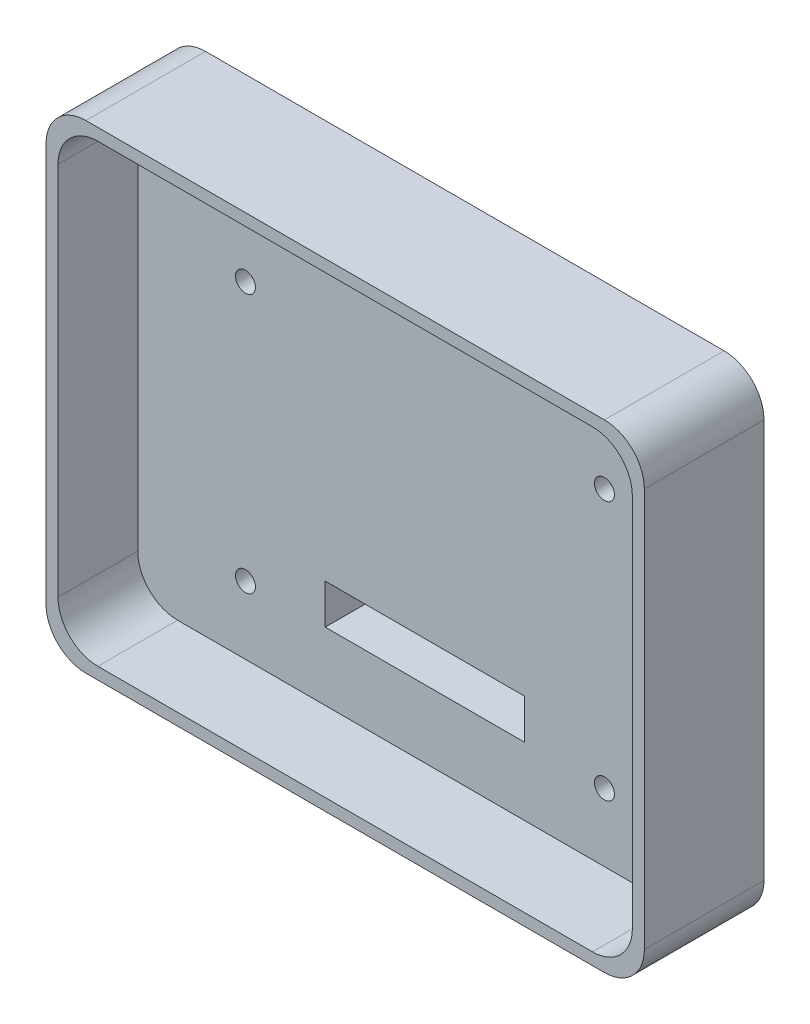
ISO-10303-21;
HEADER;
FILE_DESCRIPTION(('STEP AP214'),'2;1');
FILE_NAME('part.step','',(''),(''),'','','');
FILE_SCHEMA(('AUTOMOTIVE_DESIGN { 1 0 10303 214 1 1 1 1 }'));
ENDSEC;
DATA;
#1=APPLICATION_CONTEXT('core data for automotive mechanical design processes');
#2=APPLICATION_PROTOCOL_DEFINITION('international standard','automotive_design',2000,#1);
#3=PRODUCT_CONTEXT('',#1,'mechanical');
#4=PRODUCT('Part','Part','',(#3));
#5=PRODUCT_RELATED_PRODUCT_CATEGORY('part','',(#4));
#6=PRODUCT_DEFINITION_FORMATION('','',#4);
#7=PRODUCT_DEFINITION_CONTEXT('part definition',#1,'design');
#8=PRODUCT_DEFINITION('design','',#6,#7);
#9=PRODUCT_DEFINITION_SHAPE('','',#8);
#10=(LENGTH_UNIT() NAMED_UNIT(*) SI_UNIT(.MILLI.,.METRE.));
#11=(NAMED_UNIT(*) PLANE_ANGLE_UNIT() SI_UNIT($,.RADIAN.));
#12=(NAMED_UNIT(*) SI_UNIT($,.STERADIAN.) SOLID_ANGLE_UNIT());
#13=UNCERTAINTY_MEASURE_WITH_UNIT(LENGTH_MEASURE(1.E-05),#10,'distance_accuracy_value','');
#14=(GEOMETRIC_REPRESENTATION_CONTEXT(3) GLOBAL_UNCERTAINTY_ASSIGNED_CONTEXT((#13)) GLOBAL_UNIT_ASSIGNED_CONTEXT((#10,
#11,#12)) REPRESENTATION_CONTEXT('',''));
#15=CARTESIAN_POINT('',(0.,0.,0.));
#16=DIRECTION('',(0.,0.,1.));
#17=DIRECTION('',(1.,0.,0.));
#18=AXIS2_PLACEMENT_3D('',#15,#16,#17);
#19=CARTESIAN_POINT('',(-174.668715257413,84.7961921894447,30.));
#20=DIRECTION('',(-1.,0.,0.));
#21=DIRECTION('',(0.,-1.,0.));
#22=AXIS2_PLACEMENT_3D('',#19,#20,#21);
#23=PLANE('',#22);
#24=DIRECTION('',(0.,1.,0.));
#25=VECTOR('',#24,1.);
#26=CARTESIAN_POINT('',(-174.668715257413,84.7961921894447,30.));
#27=LINE('',#26,#25);
#28=CARTESIAN_POINT('',(-174.668715257413,-25.2038078105553,30.));
#29=VERTEX_POINT('',#28);
#30=CARTESIAN_POINT('',(-174.668715257413,74.7961921894447,30.));
#31=VERTEX_POINT('',#30);
#32=EDGE_CURVE('E344',#29,#31,#27,.T.);
#33=ORIENTED_EDGE('',*,*,#32,.F.);
#34=DIRECTION('',(0.,0.,-1.));
#35=VECTOR('',#34,1.);
#36=CARTESIAN_POINT('',(-174.668715257413,-25.2038078105553,30.));
#37=LINE('',#36,#35);
#38=CARTESIAN_POINT('',(-174.668715257413,-25.2038078105553,0.));
#39=VERTEX_POINT('',#38);
#40=EDGE_CURVE('E424',#29,#39,#37,.T.);
#41=ORIENTED_EDGE('',*,*,#40,.T.);
#42=DIRECTION('',(0.,1.,0.));
#43=VECTOR('',#42,1.);
#44=CARTESIAN_POINT('',(-174.668715257413,84.7961921894447,0.));
#45=LINE('',#44,#43);
#46=CARTESIAN_POINT('',(-174.668715257413,74.7961921894447,0.));
#47=VERTEX_POINT('',#46);
#48=EDGE_CURVE('E309',#39,#47,#45,.T.);
#49=ORIENTED_EDGE('',*,*,#48,.T.);
#50=DIRECTION('',(0.,0.,-1.));
#51=VECTOR('',#50,1.);
#52=CARTESIAN_POINT('',(-174.668715257413,74.7961921894447,30.));
#53=LINE('',#52,#51);
#54=EDGE_CURVE('E422',#47,#31,#53,.F.);
#55=ORIENTED_EDGE('',*,*,#54,.T.);
#56=EDGE_LOOP('',(#33,#41,#49,#55));
#57=FACE_BOUND('',#56,.T.);
#58=ADVANCED_FACE('F32',(#57),#23,.F.);
#59=CARTESIAN_POINT('',(-324.668715257413,84.7961921894447,30.));
#60=DIRECTION('',(0.,-1.,0.));
#61=DIRECTION('',(0.,0.,-1.));
#62=AXIS2_PLACEMENT_3D('',#59,#60,#61);
#63=PLANE('',#62);
#64=DIRECTION('',(-1.,0.,0.));
#65=VECTOR('',#64,1.);
#66=CARTESIAN_POINT('',(-324.668715257413,84.7961921894447,30.));
#67=LINE('',#66,#65);
#68=CARTESIAN_POINT('',(-184.668715257413,84.7961921894447,30.));
#69=VERTEX_POINT('',#68);
#70=CARTESIAN_POINT('',(-314.668715257413,84.7961921894447,30.));
#71=VERTEX_POINT('',#70);
#72=EDGE_CURVE('E347',#69,#71,#67,.T.);
#73=ORIENTED_EDGE('',*,*,#72,.F.);
#74=DIRECTION('',(0.,0.,-1.));
#75=VECTOR('',#74,1.);
#76=CARTESIAN_POINT('',(-184.668715257413,84.7961921894447,30.));
#77=LINE('',#76,#75);
#78=CARTESIAN_POINT('',(-184.668715257413,84.7961921894447,0.));
#79=VERTEX_POINT('',#78);
#80=EDGE_CURVE('E429',#69,#79,#77,.T.);
#81=ORIENTED_EDGE('',*,*,#80,.T.);
#82=DIRECTION('',(-1.,0.,0.));
#83=VECTOR('',#82,1.);
#84=CARTESIAN_POINT('',(-324.668715257413,84.7961921894447,0.));
#85=LINE('',#84,#83);
#86=CARTESIAN_POINT('',(-314.668715257413,84.7961921894447,0.));
#87=VERTEX_POINT('',#86);
#88=EDGE_CURVE('E360',#79,#87,#85,.T.);
#89=ORIENTED_EDGE('',*,*,#88,.T.);
#90=DIRECTION('',(0.,0.,-1.));
#91=VECTOR('',#90,1.);
#92=CARTESIAN_POINT('',(-314.668715257413,84.7961921894447,30.));
#93=LINE('',#92,#91);
#94=EDGE_CURVE('E427',#87,#71,#93,.F.);
#95=ORIENTED_EDGE('',*,*,#94,.T.);
#96=EDGE_LOOP('',(#73,#81,#89,#95));
#97=FACE_BOUND('',#96,.T.);
#98=ADVANCED_FACE('F472',(#97),#63,.F.);
#99=CARTESIAN_POINT('',(-324.668715257413,84.7961921894447,30.));
#100=DIRECTION('',(1.,0.,0.));
#101=DIRECTION('',(0.,0.,-1.));
#102=AXIS2_PLACEMENT_3D('',#99,#100,#101);
#103=PLANE('',#102);
#104=DIRECTION('',(0.,-1.,0.));
#105=VECTOR('',#104,1.);
#106=CARTESIAN_POINT('',(-324.668715257413,84.7961921894447,0.));
#107=LINE('',#106,#105);
#108=CARTESIAN_POINT('',(-324.668715257413,74.7961921894447,0.));
#109=VERTEX_POINT('',#108);
#110=CARTESIAN_POINT('',(-324.668715257413,-25.2038078105553,0.));
#111=VERTEX_POINT('',#110);
#112=EDGE_CURVE('E363',#109,#111,#107,.T.);
#113=ORIENTED_EDGE('',*,*,#112,.T.);
#114=DIRECTION('',(0.,0.,-1.));
#115=VECTOR('',#114,1.);
#116=CARTESIAN_POINT('',(-324.668715257413,-25.2038078105553,30.));
#117=LINE('',#116,#115);
#118=CARTESIAN_POINT('',(-324.668715257413,-25.2038078105553,30.));
#119=VERTEX_POINT('',#118);
#120=EDGE_CURVE('E412',#111,#119,#117,.F.);
#121=ORIENTED_EDGE('',*,*,#120,.T.);
#122=DIRECTION('',(0.,-1.,0.));
#123=VECTOR('',#122,1.);
#124=CARTESIAN_POINT('',(-324.668715257413,84.7961921894447,30.));
#125=LINE('',#124,#123);
#126=CARTESIAN_POINT('',(-324.668715257413,74.7961921894447,30.));
#127=VERTEX_POINT('',#126);
#128=EDGE_CURVE('E351',#127,#119,#125,.T.);
#129=ORIENTED_EDGE('',*,*,#128,.F.);
#130=DIRECTION('',(0.,0.,-1.));
#131=VECTOR('',#130,1.);
#132=CARTESIAN_POINT('',(-324.668715257413,74.7961921894447,30.));
#133=LINE('',#132,#131);
#134=EDGE_CURVE('E409',#127,#109,#133,.T.);
#135=ORIENTED_EDGE('',*,*,#134,.T.);
#136=EDGE_LOOP('',(#113,#121,#129,#135));
#137=FACE_BOUND('',#136,.T.);
#138=ADVANCED_FACE('F478',(#137),#103,.F.);
#139=CARTESIAN_POINT('',(-324.668715257413,-35.2038078105553,30.));
#140=DIRECTION('',(0.,1.,0.));
#141=DIRECTION('',(0.,0.,1.));
#142=AXIS2_PLACEMENT_3D('',#139,#140,#141);
#143=PLANE('',#142);
#144=DIRECTION('',(1.,0.,0.));
#145=VECTOR('',#144,1.);
#146=CARTESIAN_POINT('',(-324.668715257413,-35.2038078105553,30.));
#147=LINE('',#146,#145);
#148=CARTESIAN_POINT('',(-314.668715257413,-35.2038078105553,30.));
#149=VERTEX_POINT('',#148);
#150=CARTESIAN_POINT('',(-184.668715257413,-35.2038078105553,30.));
#151=VERTEX_POINT('',#150);
#152=EDGE_CURVE('E354',#149,#151,#147,.T.);
#153=ORIENTED_EDGE('',*,*,#152,.F.);
#154=DIRECTION('',(0.,0.,-1.));
#155=VECTOR('',#154,1.);
#156=CARTESIAN_POINT('',(-314.668715257413,-35.2038078105553,30.));
#157=LINE('',#156,#155);
#158=CARTESIAN_POINT('',(-314.668715257413,-35.2038078105553,0.));
#159=VERTEX_POINT('',#158);
#160=EDGE_CURVE('E398',#149,#159,#157,.T.);
#161=ORIENTED_EDGE('',*,*,#160,.T.);
#162=DIRECTION('',(1.,0.,0.));
#163=VECTOR('',#162,1.);
#164=CARTESIAN_POINT('',(-324.668715257413,-35.2038078105553,0.));
#165=LINE('',#164,#163);
#166=CARTESIAN_POINT('',(-307.168715257413,-35.2038078105553,0.));
#167=VERTEX_POINT('',#166);
#168=EDGE_CURVE('E348',#159,#167,#165,.T.);
#169=ORIENTED_EDGE('',*,*,#168,.T.);
#170=DIRECTION('',(0.,0.,-1.));
#171=VECTOR('',#170,1.);
#172=CARTESIAN_POINT('',(-307.168715257413,-35.2038078105553,6.5));
#173=LINE('',#172,#171);
#174=CARTESIAN_POINT('',(-307.168715257413,-35.2038078105553,6.5));
#175=VERTEX_POINT('',#174);
#176=EDGE_CURVE('E339',#175,#167,#173,.T.);
#177=ORIENTED_EDGE('',*,*,#176,.F.);
#178=DIRECTION('',(-1.,0.,0.));
#179=VECTOR('',#178,1.);
#180=CARTESIAN_POINT('',(-282.168715257413,-35.2038078105553,6.5));
#181=LINE('',#180,#179);
#182=CARTESIAN_POINT('',(-282.168715257413,-35.2038078105553,6.5));
#183=VERTEX_POINT('',#182);
#184=EDGE_CURVE('E319',#183,#175,#181,.T.);
#185=ORIENTED_EDGE('',*,*,#184,.F.);
#186=DIRECTION('',(0.,0.,-1.));
#187=VECTOR('',#186,1.);
#188=CARTESIAN_POINT('',(-282.168715257413,-35.2038078105553,6.5));
#189=LINE('',#188,#187);
#190=CARTESIAN_POINT('',(-282.168715257413,-35.2038078105553,0.));
#191=VERTEX_POINT('',#190);
#192=EDGE_CURVE('E329',#183,#191,#189,.T.);
#193=ORIENTED_EDGE('',*,*,#192,.T.);
#194=CARTESIAN_POINT('',(-217.168715257413,-35.2038078105553,0.));
#195=VERTEX_POINT('',#194);
#196=EDGE_CURVE('E368',#191,#195,#165,.T.);
#197=ORIENTED_EDGE('',*,*,#196,.T.);
#198=DIRECTION('',(0.,0.,-1.));
#199=VECTOR('',#198,1.);
#200=CARTESIAN_POINT('',(-217.168715257413,-35.2038078105553,6.5));
#201=LINE('',#200,#199);
#202=CARTESIAN_POINT('',(-217.168715257413,-35.2038078105553,6.5));
#203=VERTEX_POINT('',#202);
#204=EDGE_CURVE('E312',#203,#195,#201,.T.);
#205=ORIENTED_EDGE('',*,*,#204,.F.);
#206=DIRECTION('',(-1.,0.,0.));
#207=VECTOR('',#206,1.);
#208=CARTESIAN_POINT('',(-192.168715257413,-35.2038078105553,6.5));
#209=LINE('',#208,#207);
#210=CARTESIAN_POINT('',(-192.168715257413,-35.2038078105553,6.5));
#211=VERTEX_POINT('',#210);
#212=EDGE_CURVE('E288',#211,#203,#209,.T.);
#213=ORIENTED_EDGE('',*,*,#212,.F.);
#214=DIRECTION('',(0.,0.,-1.));
#215=VECTOR('',#214,1.);
#216=CARTESIAN_POINT('',(-192.168715257413,-35.2038078105553,6.5));
#217=LINE('',#216,#215);
#218=CARTESIAN_POINT('',(-192.168715257413,-35.2038078105553,0.));
#219=VERTEX_POINT('',#218);
#220=EDGE_CURVE('E298',#211,#219,#217,.T.);
#221=ORIENTED_EDGE('',*,*,#220,.T.);
#222=CARTESIAN_POINT('',(-184.668715257413,-35.2038078105553,0.));
#223=VERTEX_POINT('',#222);
#224=EDGE_CURVE('E366',#219,#223,#165,.T.);
#225=ORIENTED_EDGE('',*,*,#224,.T.);
#226=DIRECTION('',(0.,0.,-1.));
#227=VECTOR('',#226,1.);
#228=CARTESIAN_POINT('',(-184.668715257413,-35.2038078105553,30.));
#229=LINE('',#228,#227);
#230=EDGE_CURVE('E396',#223,#151,#229,.F.);
#231=ORIENTED_EDGE('',*,*,#230,.T.);
#232=EDGE_LOOP('',(#153,#161,#169,#177,#185,#193,#197,#205,#213,#221,#225,#231));
#233=FACE_BOUND('',#232,.T.);
#234=ADVANCED_FACE('F534',(#233),#143,.F.);
#235=CARTESIAN_POINT('',(0.,0.,30.));
#236=DIRECTION('',(0.,0.,1.));
#237=DIRECTION('',(1.,0.,0.));
#238=AXIS2_PLACEMENT_3D('',#235,#236,#237);
#239=PLANE('',#238);
#240=DIRECTION('',(0.,1.,0.));
#241=VECTOR('',#240,1.);
#242=CARTESIAN_POINT('',(-177.668715257413,81.7961921894447,30.));
#243=LINE('',#242,#241);
#244=CARTESIAN_POINT('',(-177.668715257413,-22.2038078105553,30.));
#245=VERTEX_POINT('',#244);
#246=CARTESIAN_POINT('',(-177.668715257413,71.7961921894447,30.));
#247=VERTEX_POINT('',#246);
#248=EDGE_CURVE('E274',#245,#247,#243,.T.);
#249=ORIENTED_EDGE('',*,*,#248,.F.);
#250=CARTESIAN_POINT('',(-187.668715257413,-22.2038078105553,30.));
#251=DIRECTION('',(0.,0.,1.));
#252=DIRECTION('',(1.,0.,0.));
#253=AXIS2_PLACEMENT_3D('',#250,#251,#252);
#254=CIRCLE('',#253,10.);
#255=CARTESIAN_POINT('',(-187.668715257413,-32.2038078105553,30.));
#256=VERTEX_POINT('',#255);
#257=EDGE_CURVE('E432',#245,#256,#254,.F.);
#258=ORIENTED_EDGE('',*,*,#257,.T.);
#259=DIRECTION('',(1.,0.,0.));
#260=VECTOR('',#259,1.);
#261=CARTESIAN_POINT('',(-321.668715257413,-32.2038078105553,30.));
#262=LINE('',#261,#260);
#263=CARTESIAN_POINT('',(-311.668715257413,-32.2038078105553,30.));
#264=VERTEX_POINT('',#263);
#265=EDGE_CURVE('E264',#264,#256,#262,.T.);
#266=ORIENTED_EDGE('',*,*,#265,.F.);
#267=CARTESIAN_POINT('',(-311.668715257413,-22.2038078105553,30.));
#268=DIRECTION('',(0.,0.,1.));
#269=DIRECTION('',(1.,0.,0.));
#270=AXIS2_PLACEMENT_3D('',#267,#268,#269);
#271=CIRCLE('',#270,10.);
#272=CARTESIAN_POINT('',(-321.668715257413,-22.2038078105553,30.));
#273=VERTEX_POINT('',#272);
#274=EDGE_CURVE('E434',#264,#273,#271,.F.);
#275=ORIENTED_EDGE('',*,*,#274,.T.);
#276=DIRECTION('',(0.,-1.,0.));
#277=VECTOR('',#276,1.);
#278=CARTESIAN_POINT('',(-321.668715257413,81.7961921894447,30.));
#279=LINE('',#278,#277);
#280=CARTESIAN_POINT('',(-321.668715257413,71.7961921894447,30.));
#281=VERTEX_POINT('',#280);
#282=EDGE_CURVE('E280',#281,#273,#279,.T.);
#283=ORIENTED_EDGE('',*,*,#282,.F.);
#284=CARTESIAN_POINT('',(-311.668715257413,71.7961921894447,30.));
#285=DIRECTION('',(0.,0.,1.));
#286=DIRECTION('',(1.,0.,0.));
#287=AXIS2_PLACEMENT_3D('',#284,#285,#286);
#288=CIRCLE('',#287,10.);
#289=CARTESIAN_POINT('',(-311.668715257413,81.7961921894447,30.));
#290=VERTEX_POINT('',#289);
#291=EDGE_CURVE('E436',#281,#290,#288,.F.);
#292=ORIENTED_EDGE('',*,*,#291,.T.);
#293=DIRECTION('',(-1.,0.,0.));
#294=VECTOR('',#293,1.);
#295=CARTESIAN_POINT('',(-321.668715257413,81.7961921894447,30.));
#296=LINE('',#295,#294);
#297=CARTESIAN_POINT('',(-187.668715257413,81.7961921894447,30.));
#298=VERTEX_POINT('',#297);
#299=EDGE_CURVE('E277',#298,#290,#296,.T.);
#300=ORIENTED_EDGE('',*,*,#299,.F.);
#301=CARTESIAN_POINT('',(-187.668715257413,71.7961921894447,30.));
#302=DIRECTION('',(0.,0.,1.));
#303=DIRECTION('',(1.,0.,0.));
#304=AXIS2_PLACEMENT_3D('',#301,#302,#303);
#305=CIRCLE('',#304,10.);
#306=EDGE_CURVE('E438',#298,#247,#305,.F.);
#307=ORIENTED_EDGE('',*,*,#306,.T.);
#308=EDGE_LOOP('',(#249,#258,#266,#275,#283,#292,#300,#307));
#309=FACE_BOUND('',#308,.T.);
#310=ORIENTED_EDGE('',*,*,#128,.T.);
#311=CARTESIAN_POINT('',(-314.668715257413,-25.2038078105553,30.));
#312=DIRECTION('',(0.,0.,1.));
#313=DIRECTION('',(1.,0.,0.));
#314=AXIS2_PLACEMENT_3D('',#311,#312,#313);
#315=CIRCLE('',#314,10.);
#316=EDGE_CURVE('E420',#119,#149,#315,.T.);
#317=ORIENTED_EDGE('',*,*,#316,.T.);
#318=ORIENTED_EDGE('',*,*,#152,.T.);
#319=CARTESIAN_POINT('',(-184.668715257413,-25.2038078105553,30.));
#320=DIRECTION('',(0.,0.,1.));
#321=DIRECTION('',(1.,0.,0.));
#322=AXIS2_PLACEMENT_3D('',#319,#320,#321);
#323=CIRCLE('',#322,10.);
#324=EDGE_CURVE('E418',#151,#29,#323,.T.);
#325=ORIENTED_EDGE('',*,*,#324,.T.);
#326=ORIENTED_EDGE('',*,*,#32,.T.);
#327=CARTESIAN_POINT('',(-184.668715257413,74.7961921894447,30.));
#328=DIRECTION('',(0.,0.,1.));
#329=DIRECTION('',(1.,0.,0.));
#330=AXIS2_PLACEMENT_3D('',#327,#328,#329);
#331=CIRCLE('',#330,10.);
#332=EDGE_CURVE('E416',#31,#69,#331,.T.);
#333=ORIENTED_EDGE('',*,*,#332,.T.);
#334=ORIENTED_EDGE('',*,*,#72,.T.);
#335=CARTESIAN_POINT('',(-314.668715257413,74.7961921894447,30.));
#336=DIRECTION('',(0.,0.,1.));
#337=DIRECTION('',(1.,0.,0.));
#338=AXIS2_PLACEMENT_3D('',#335,#336,#337);
#339=CIRCLE('',#338,10.);
#340=EDGE_CURVE('E414',#71,#127,#339,.T.);
#341=ORIENTED_EDGE('',*,*,#340,.T.);
#342=EDGE_LOOP('',(#310,#317,#318,#325,#326,#333,#334,#341));
#343=FACE_BOUND('',#342,.T.);
#344=ADVANCED_FACE('F520',(#309,#343),#239,.T.);
#345=CARTESIAN_POINT('',(0.,0.,0.));
#346=DIRECTION('',(0.,0.,1.));
#347=DIRECTION('',(1.,0.,0.));
#348=AXIS2_PLACEMENT_3D('',#345,#346,#347);
#349=PLANE('',#348);
#350=DIRECTION('',(1.,0.,0.));
#351=VECTOR('',#350,1.);
#352=CARTESIAN_POINT('',(-224.668715257413,-5.20380781055533,0.));
#353=LINE('',#352,#351);
#354=CARTESIAN_POINT('',(-274.668715257413,-5.20380781055533,0.));
#355=VERTEX_POINT('',#354);
#356=CARTESIAN_POINT('',(-224.668715257413,-5.20380781055533,0.));
#357=VERTEX_POINT('',#356);
#358=EDGE_CURVE('E228',#355,#357,#353,.T.);
#359=ORIENTED_EDGE('',*,*,#358,.F.);
#360=DIRECTION('',(0.,1.,0.));
#361=VECTOR('',#360,1.);
#362=CARTESIAN_POINT('',(-274.668715257413,-5.20380781055533,0.));
#363=LINE('',#362,#361);
#364=CARTESIAN_POINT('',(-274.668715257413,-15.2038078105553,0.));
#365=VERTEX_POINT('',#364);
#366=EDGE_CURVE('E47',#365,#355,#363,.T.);
#367=ORIENTED_EDGE('',*,*,#366,.F.);
#368=DIRECTION('',(-1.,0.,0.));
#369=VECTOR('',#368,1.);
#370=CARTESIAN_POINT('',(-224.668715257413,-15.2038078105553,0.));
#371=LINE('',#370,#369);
#372=CARTESIAN_POINT('',(-224.668715257413,-15.2038078105553,0.));
#373=VERTEX_POINT('',#372);
#374=EDGE_CURVE('E235',#373,#365,#371,.T.);
#375=ORIENTED_EDGE('',*,*,#374,.F.);
#376=DIRECTION('',(0.,-1.,0.));
#377=VECTOR('',#376,1.);
#378=CARTESIAN_POINT('',(-224.668715257413,-5.20380781055533,0.));
#379=LINE('',#378,#377);
#380=EDGE_CURVE('E219',#357,#373,#379,.T.);
#381=ORIENTED_EDGE('',*,*,#380,.F.);
#382=EDGE_LOOP('',(#359,#367,#375,#381));
#383=FACE_BOUND('',#382,.T.);
#384=ORIENTED_EDGE('',*,*,#168,.F.);
#385=CARTESIAN_POINT('',(-314.668715257413,-25.2038078105553,0.));
#386=DIRECTION('',(0.,0.,1.));
#387=DIRECTION('',(1.,0.,0.));
#388=AXIS2_PLACEMENT_3D('',#385,#386,#387);
#389=CIRCLE('',#388,10.);
#390=EDGE_CURVE('E407',#159,#111,#389,.F.);
#391=ORIENTED_EDGE('',*,*,#390,.T.);
#392=ORIENTED_EDGE('',*,*,#112,.F.);
#393=CARTESIAN_POINT('',(-314.668715257413,74.7961921894447,0.));
#394=DIRECTION('',(0.,0.,1.));
#395=DIRECTION('',(1.,0.,0.));
#396=AXIS2_PLACEMENT_3D('',#393,#394,#395);
#397=CIRCLE('',#396,10.);
#398=EDGE_CURVE('E401',#109,#87,#397,.F.);
#399=ORIENTED_EDGE('',*,*,#398,.T.);
#400=ORIENTED_EDGE('',*,*,#88,.F.);
#401=CARTESIAN_POINT('',(-184.668715257413,74.7961921894447,0.));
#402=DIRECTION('',(0.,0.,1.));
#403=DIRECTION('',(1.,0.,0.));
#404=AXIS2_PLACEMENT_3D('',#401,#402,#403);
#405=CIRCLE('',#404,10.);
#406=EDGE_CURVE('E403',#79,#47,#405,.F.);
#407=ORIENTED_EDGE('',*,*,#406,.T.);
#408=ORIENTED_EDGE('',*,*,#48,.F.);
#409=CARTESIAN_POINT('',(-184.668715257413,-25.2038078105553,0.));
#410=DIRECTION('',(0.,0.,1.));
#411=DIRECTION('',(1.,0.,0.));
#412=AXIS2_PLACEMENT_3D('',#409,#410,#411);
#413=CIRCLE('',#412,10.);
#414=EDGE_CURVE('E405',#39,#223,#413,.F.);
#415=ORIENTED_EDGE('',*,*,#414,.T.);
#416=ORIENTED_EDGE('',*,*,#224,.F.);
#417=DIRECTION('',(0.,-1.,0.));
#418=VECTOR('',#417,1.);
#419=CARTESIAN_POINT('',(-192.168715257413,-35.2038078105553,0.));
#420=LINE('',#419,#418);
#421=CARTESIAN_POINT('',(-192.168715257413,69.7961921894447,0.));
#422=VERTEX_POINT('',#421);
#423=EDGE_CURVE('E299',#422,#219,#420,.T.);
#424=ORIENTED_EDGE('',*,*,#423,.F.);
#425=DIRECTION('',(1.,0.,0.));
#426=VECTOR('',#425,1.);
#427=CARTESIAN_POINT('',(-192.168715257413,69.7961921894447,0.));
#428=LINE('',#427,#426);
#429=CARTESIAN_POINT('',(-217.168715257413,69.7961921894447,0.));
#430=VERTEX_POINT('',#429);
#431=EDGE_CURVE('E289',#430,#422,#428,.T.);
#432=ORIENTED_EDGE('',*,*,#431,.F.);
#433=DIRECTION('',(0.,1.,0.));
#434=VECTOR('',#433,1.);
#435=CARTESIAN_POINT('',(-217.168715257413,-35.2038078105553,0.));
#436=LINE('',#435,#434);
#437=EDGE_CURVE('E301',#195,#430,#436,.T.);
#438=ORIENTED_EDGE('',*,*,#437,.F.);
#439=ORIENTED_EDGE('',*,*,#196,.F.);
#440=DIRECTION('',(0.,-1.,0.));
#441=VECTOR('',#440,1.);
#442=CARTESIAN_POINT('',(-282.168715257413,-35.2038078105553,0.));
#443=LINE('',#442,#441);
#444=CARTESIAN_POINT('',(-282.168715257413,69.7961921894447,0.));
#445=VERTEX_POINT('',#444);
#446=EDGE_CURVE('E273',#445,#191,#443,.T.);
#447=ORIENTED_EDGE('',*,*,#446,.F.);
#448=DIRECTION('',(1.,0.,0.));
#449=VECTOR('',#448,1.);
#450=CARTESIAN_POINT('',(-282.168715257413,69.7961921894447,0.));
#451=LINE('',#450,#449);
#452=CARTESIAN_POINT('',(-307.168715257413,69.7961921894447,0.));
#453=VERTEX_POINT('',#452);
#454=EDGE_CURVE('E320',#453,#445,#451,.T.);
#455=ORIENTED_EDGE('',*,*,#454,.F.);
#456=DIRECTION('',(0.,1.,0.));
#457=VECTOR('',#456,1.);
#458=CARTESIAN_POINT('',(-307.168715257413,-35.2038078105553,0.));
#459=LINE('',#458,#457);
#460=EDGE_CURVE('E331',#167,#453,#459,.T.);
#461=ORIENTED_EDGE('',*,*,#460,.F.);
#462=EDGE_LOOP('',(#384,#391,#392,#399,#400,#407,#408,#415,#416,#424,#432,#438,#439,#447,#455,#461));
#463=FACE_BOUND('',#462,.T.);
#464=ADVANCED_FACE('F232',(#383,#463),#349,.F.);
#465=CARTESIAN_POINT('',(-282.168715257413,-35.2038078105553,6.5));
#466=DIRECTION('',(1.,0.,0.));
#467=DIRECTION('',(0.,0.,-1.));
#468=AXIS2_PLACEMENT_3D('',#465,#466,#467);
#469=PLANE('',#468);
#470=ORIENTED_EDGE('',*,*,#446,.T.);
#471=ORIENTED_EDGE('',*,*,#192,.F.);
#472=DIRECTION('',(0.,-1.,0.));
#473=VECTOR('',#472,1.);
#474=CARTESIAN_POINT('',(-282.168715257413,-35.2038078105553,6.5));
#475=LINE('',#474,#473);
#476=CARTESIAN_POINT('',(-282.168715257413,69.7961921894447,6.5));
#477=VERTEX_POINT('',#476);
#478=EDGE_CURVE('E316',#477,#183,#475,.T.);
#479=ORIENTED_EDGE('',*,*,#478,.F.);
#480=DIRECTION('',(0.,0.,-1.));
#481=VECTOR('',#480,1.);
#482=CARTESIAN_POINT('',(-282.168715257413,69.7961921894447,6.5));
#483=LINE('',#482,#481);
#484=EDGE_CURVE('E302',#477,#445,#483,.T.);
#485=ORIENTED_EDGE('',*,*,#484,.T.);
#486=EDGE_LOOP('',(#470,#471,#479,#485));
#487=FACE_BOUND('',#486,.T.);
#488=ADVANCED_FACE('F587',(#487),#469,.F.);
#489=CARTESIAN_POINT('',(-282.168715257413,69.7961921894447,6.5));
#490=DIRECTION('',(0.,1.,0.));
#491=DIRECTION('',(0.,0.,1.));
#492=AXIS2_PLACEMENT_3D('',#489,#490,#491);
#493=PLANE('',#492);
#494=ORIENTED_EDGE('',*,*,#454,.T.);
#495=ORIENTED_EDGE('',*,*,#484,.F.);
#496=DIRECTION('',(1.,0.,0.));
#497=VECTOR('',#496,1.);
#498=CARTESIAN_POINT('',(-282.168715257413,69.7961921894447,6.5));
#499=LINE('',#498,#497);
#500=CARTESIAN_POINT('',(-307.168715257413,69.7961921894447,6.5));
#501=VERTEX_POINT('',#500);
#502=EDGE_CURVE('E326',#501,#477,#499,.T.);
#503=ORIENTED_EDGE('',*,*,#502,.F.);
#504=DIRECTION('',(0.,0.,-1.));
#505=VECTOR('',#504,1.);
#506=CARTESIAN_POINT('',(-307.168715257413,69.7961921894447,6.5));
#507=LINE('',#506,#505);
#508=EDGE_CURVE('E337',#501,#453,#507,.T.);
#509=ORIENTED_EDGE('',*,*,#508,.T.);
#510=EDGE_LOOP('',(#494,#495,#503,#509));
#511=FACE_BOUND('',#510,.T.);
#512=ADVANCED_FACE('F584',(#511),#493,.F.);
#513=CARTESIAN_POINT('',(-307.168715257413,-35.2038078105553,6.5));
#514=DIRECTION('',(-1.,0.,0.));
#515=DIRECTION('',(0.,-1.,0.));
#516=AXIS2_PLACEMENT_3D('',#513,#514,#515);
#517=PLANE('',#516);
#518=ORIENTED_EDGE('',*,*,#460,.T.);
#519=ORIENTED_EDGE('',*,*,#508,.F.);
#520=DIRECTION('',(0.,1.,0.));
#521=VECTOR('',#520,1.);
#522=CARTESIAN_POINT('',(-307.168715257413,-35.2038078105553,6.5));
#523=LINE('',#522,#521);
#524=EDGE_CURVE('E323',#175,#501,#523,.T.);
#525=ORIENTED_EDGE('',*,*,#524,.F.);
#526=ORIENTED_EDGE('',*,*,#176,.T.);
#527=EDGE_LOOP('',(#518,#519,#525,#526));
#528=FACE_BOUND('',#527,.T.);
#529=ADVANCED_FACE('F546',(#528),#517,.F.);
#530=CARTESIAN_POINT('',(0.,0.,6.5));
#531=DIRECTION('',(0.,0.,1.));
#532=DIRECTION('',(1.,0.,0.));
#533=AXIS2_PLACEMENT_3D('',#530,#531,#532);
#534=PLANE('',#533);
#535=CARTESIAN_POINT('',(-294.668715257413,49.7961921894447,6.5));
#536=DIRECTION('',(0.,0.,-1.));
#537=DIRECTION('',(-1.,0.,0.));
#538=AXIS2_PLACEMENT_3D('',#535,#536,#537);
#539=CIRCLE('',#538,2.5);
#540=CARTESIAN_POINT('',(-297.168715257413,49.7961921894447,6.5));
#541=VERTEX_POINT('',#540);
#542=EDGE_CURVE('E252',#541,#541,#539,.T.);
#543=ORIENTED_EDGE('',*,*,#542,.F.);
#544=EDGE_LOOP('',(#543));
#545=FACE_BOUND('',#544,.T.);
#546=CARTESIAN_POINT('',(-294.668715257413,-15.2038078105553,6.5));
#547=DIRECTION('',(0.,0.,-1.));
#548=DIRECTION('',(-1.,0.,0.));
#549=AXIS2_PLACEMENT_3D('',#546,#547,#548);
#550=CIRCLE('',#549,2.5);
#551=CARTESIAN_POINT('',(-297.168715257413,-15.2038078105553,6.5));
#552=VERTEX_POINT('',#551);
#553=EDGE_CURVE('E256',#552,#552,#550,.T.);
#554=ORIENTED_EDGE('',*,*,#553,.F.);
#555=EDGE_LOOP('',(#554));
#556=FACE_BOUND('',#555,.T.);
#557=ORIENTED_EDGE('',*,*,#478,.T.);
#558=ORIENTED_EDGE('',*,*,#184,.T.);
#559=ORIENTED_EDGE('',*,*,#524,.T.);
#560=ORIENTED_EDGE('',*,*,#502,.T.);
#561=EDGE_LOOP('',(#557,#558,#559,#560));
#562=FACE_BOUND('',#561,.T.);
#563=ADVANCED_FACE('F549',(#545,#556,#562),#534,.F.);
#564=CARTESIAN_POINT('',(-192.168715257413,-35.2038078105553,6.5));
#565=DIRECTION('',(1.,0.,0.));
#566=DIRECTION('',(0.,1.,0.));
#567=AXIS2_PLACEMENT_3D('',#564,#565,#566);
#568=PLANE('',#567);
#569=ORIENTED_EDGE('',*,*,#423,.T.);
#570=ORIENTED_EDGE('',*,*,#220,.F.);
#571=DIRECTION('',(0.,-1.,0.));
#572=VECTOR('',#571,1.);
#573=CARTESIAN_POINT('',(-192.168715257413,-35.2038078105553,6.5));
#574=LINE('',#573,#572);
#575=CARTESIAN_POINT('',(-192.168715257413,69.7961921894447,6.5));
#576=VERTEX_POINT('',#575);
#577=EDGE_CURVE('E285',#576,#211,#574,.T.);
#578=ORIENTED_EDGE('',*,*,#577,.F.);
#579=DIRECTION('',(0.,0.,-1.));
#580=VECTOR('',#579,1.);
#581=CARTESIAN_POINT('',(-192.168715257413,69.7961921894447,6.5));
#582=LINE('',#581,#580);
#583=EDGE_CURVE('E307',#576,#422,#582,.T.);
#584=ORIENTED_EDGE('',*,*,#583,.T.);
#585=EDGE_LOOP('',(#569,#570,#578,#584));
#586=FACE_BOUND('',#585,.T.);
#587=ADVANCED_FACE('F567',(#586),#568,.F.);
#588=CARTESIAN_POINT('',(-192.168715257413,69.7961921894447,6.5));
#589=DIRECTION('',(0.,1.,0.));
#590=DIRECTION('',(0.,0.,1.));
#591=AXIS2_PLACEMENT_3D('',#588,#589,#590);
#592=PLANE('',#591);
#593=ORIENTED_EDGE('',*,*,#431,.T.);
#594=ORIENTED_EDGE('',*,*,#583,.F.);
#595=DIRECTION('',(1.,0.,0.));
#596=VECTOR('',#595,1.);
#597=CARTESIAN_POINT('',(-192.168715257413,69.7961921894447,6.5));
#598=LINE('',#597,#596);
#599=CARTESIAN_POINT('',(-217.168715257413,69.7961921894447,6.5));
#600=VERTEX_POINT('',#599);
#601=EDGE_CURVE('E295',#600,#576,#598,.T.);
#602=ORIENTED_EDGE('',*,*,#601,.F.);
#603=DIRECTION('',(0.,0.,-1.));
#604=VECTOR('',#603,1.);
#605=CARTESIAN_POINT('',(-217.168715257413,69.7961921894447,6.5));
#606=LINE('',#605,#604);
#607=EDGE_CURVE('E310',#600,#430,#606,.T.);
#608=ORIENTED_EDGE('',*,*,#607,.T.);
#609=EDGE_LOOP('',(#593,#594,#602,#608));
#610=FACE_BOUND('',#609,.T.);
#611=ADVANCED_FACE('F569',(#610),#592,.F.);
#612=CARTESIAN_POINT('',(-217.168715257413,-35.2038078105553,6.5));
#613=DIRECTION('',(-1.,0.,0.));
#614=DIRECTION('',(0.,0.,1.));
#615=AXIS2_PLACEMENT_3D('',#612,#613,#614);
#616=PLANE('',#615);
#617=ORIENTED_EDGE('',*,*,#437,.T.);
#618=ORIENTED_EDGE('',*,*,#607,.F.);
#619=DIRECTION('',(0.,1.,0.));
#620=VECTOR('',#619,1.);
#621=CARTESIAN_POINT('',(-217.168715257413,-35.2038078105553,6.5));
#622=LINE('',#621,#620);
#623=EDGE_CURVE('E292',#203,#600,#622,.T.);
#624=ORIENTED_EDGE('',*,*,#623,.F.);
#625=ORIENTED_EDGE('',*,*,#204,.T.);
#626=EDGE_LOOP('',(#617,#618,#624,#625));
#627=FACE_BOUND('',#626,.T.);
#628=ADVANCED_FACE('F560',(#627),#616,.F.);
#629=CARTESIAN_POINT('',(0.,0.,6.5));
#630=DIRECTION('',(0.,0.,1.));
#631=DIRECTION('',(1.,0.,0.));
#632=AXIS2_PLACEMENT_3D('',#629,#630,#631);
#633=PLANE('',#632);
#634=CARTESIAN_POINT('',(-204.668715257413,49.7961921894447,6.5));
#635=DIRECTION('',(0.,0.,-1.));
#636=DIRECTION('',(-1.,0.,0.));
#637=AXIS2_PLACEMENT_3D('',#634,#635,#636);
#638=CIRCLE('',#637,2.5);
#639=CARTESIAN_POINT('',(-207.168715257413,49.7961921894447,6.5));
#640=VERTEX_POINT('',#639);
#641=EDGE_CURVE('E242',#640,#640,#638,.T.);
#642=ORIENTED_EDGE('',*,*,#641,.F.);
#643=EDGE_LOOP('',(#642));
#644=FACE_BOUND('',#643,.T.);
#645=CARTESIAN_POINT('',(-204.668715257413,-15.2038078105553,6.5));
#646=DIRECTION('',(0.,0.,-1.));
#647=DIRECTION('',(-1.,0.,0.));
#648=AXIS2_PLACEMENT_3D('',#645,#646,#647);
#649=CIRCLE('',#648,2.5);
#650=CARTESIAN_POINT('',(-207.168715257413,-15.2038078105553,6.5));
#651=VERTEX_POINT('',#650);
#652=EDGE_CURVE('E248',#651,#651,#649,.T.);
#653=ORIENTED_EDGE('',*,*,#652,.F.);
#654=EDGE_LOOP('',(#653));
#655=FACE_BOUND('',#654,.T.);
#656=ORIENTED_EDGE('',*,*,#577,.T.);
#657=ORIENTED_EDGE('',*,*,#212,.T.);
#658=ORIENTED_EDGE('',*,*,#623,.T.);
#659=ORIENTED_EDGE('',*,*,#601,.T.);
#660=EDGE_LOOP('',(#656,#657,#658,#659));
#661=FACE_BOUND('',#660,.T.);
#662=ADVANCED_FACE('F563',(#644,#655,#661),#633,.F.);
#663=CARTESIAN_POINT('',(-177.668715257413,81.7961921894447,10.));
#664=DIRECTION('',(1.,0.,0.));
#665=DIRECTION('',(0.,1.,0.));
#666=AXIS2_PLACEMENT_3D('',#663,#664,#665);
#667=PLANE('',#666);
#668=DIRECTION('',(0.,1.,0.));
#669=VECTOR('',#668,1.);
#670=CARTESIAN_POINT('',(-177.668715257413,81.7961921894447,10.));
#671=LINE('',#670,#669);
#672=CARTESIAN_POINT('',(-177.668715257413,-22.2038078105553,10.));
#673=VERTEX_POINT('',#672);
#674=CARTESIAN_POINT('',(-177.668715257413,71.7961921894447,10.));
#675=VERTEX_POINT('',#674);
#676=EDGE_CURVE('E260',#673,#675,#671,.T.);
#677=ORIENTED_EDGE('',*,*,#676,.F.);
#678=DIRECTION('',(0.,0.,1.));
#679=VECTOR('',#678,1.);
#680=CARTESIAN_POINT('',(-177.668715257413,-22.2038078105553,30.));
#681=LINE('',#680,#679);
#682=EDGE_CURVE('E370',#673,#245,#681,.T.);
#683=ORIENTED_EDGE('',*,*,#682,.T.);
#684=ORIENTED_EDGE('',*,*,#248,.T.);
#685=DIRECTION('',(0.,0.,1.));
#686=VECTOR('',#685,1.);
#687=CARTESIAN_POINT('',(-177.668715257413,71.7961921894447,10.));
#688=LINE('',#687,#686);
#689=EDGE_CURVE('E357',#247,#675,#688,.F.);
#690=ORIENTED_EDGE('',*,*,#689,.T.);
#691=EDGE_LOOP('',(#677,#683,#684,#690));
#692=FACE_BOUND('',#691,.T.);
#693=ADVANCED_FACE('F683',(#692),#667,.F.);
#694=CARTESIAN_POINT('',(-321.668715257413,-32.2038078105553,10.));
#695=DIRECTION('',(0.,-1.,0.));
#696=DIRECTION('',(0.,0.,-1.));
#697=AXIS2_PLACEMENT_3D('',#694,#695,#696);
#698=PLANE('',#697);
#699=ORIENTED_EDGE('',*,*,#265,.T.);
#700=DIRECTION('',(0.,0.,1.));
#701=VECTOR('',#700,1.);
#702=CARTESIAN_POINT('',(-187.668715257413,-32.2038078105553,10.));
#703=LINE('',#702,#701);
#704=CARTESIAN_POINT('',(-187.668715257413,-32.2038078105553,10.));
#705=VERTEX_POINT('',#704);
#706=EDGE_CURVE('E376',#256,#705,#703,.F.);
#707=ORIENTED_EDGE('',*,*,#706,.T.);
#708=DIRECTION('',(1.,0.,0.));
#709=VECTOR('',#708,1.);
#710=CARTESIAN_POINT('',(-321.668715257413,-32.2038078105553,10.));
#711=LINE('',#710,#709);
#712=CARTESIAN_POINT('',(-311.668715257413,-32.2038078105553,10.));
#713=VERTEX_POINT('',#712);
#714=EDGE_CURVE('E270',#713,#705,#711,.T.);
#715=ORIENTED_EDGE('',*,*,#714,.F.);
#716=DIRECTION('',(0.,0.,1.));
#717=VECTOR('',#716,1.);
#718=CARTESIAN_POINT('',(-311.668715257413,-32.2038078105553,30.));
#719=LINE('',#718,#717);
#720=EDGE_CURVE('E373',#713,#264,#719,.T.);
#721=ORIENTED_EDGE('',*,*,#720,.T.);
#722=EDGE_LOOP('',(#699,#707,#715,#721));
#723=FACE_BOUND('',#722,.T.);
#724=ADVANCED_FACE('F689',(#723),#698,.F.);
#725=CARTESIAN_POINT('',(-321.668715257413,81.7961921894447,10.));
#726=DIRECTION('',(-1.,0.,0.));
#727=DIRECTION('',(0.,0.,1.));
#728=AXIS2_PLACEMENT_3D('',#725,#726,#727);
#729=PLANE('',#728);
#730=ORIENTED_EDGE('',*,*,#282,.T.);
#731=DIRECTION('',(0.,0.,1.));
#732=VECTOR('',#731,1.);
#733=CARTESIAN_POINT('',(-321.668715257413,-22.2038078105553,10.));
#734=LINE('',#733,#732);
#735=CARTESIAN_POINT('',(-321.668715257413,-22.2038078105553,10.));
#736=VERTEX_POINT('',#735);
#737=EDGE_CURVE('E389',#273,#736,#734,.F.);
#738=ORIENTED_EDGE('',*,*,#737,.T.);
#739=DIRECTION('',(0.,-1.,0.));
#740=VECTOR('',#739,1.);
#741=CARTESIAN_POINT('',(-321.668715257413,81.7961921894447,10.));
#742=LINE('',#741,#740);
#743=CARTESIAN_POINT('',(-321.668715257413,71.7961921894447,10.));
#744=VERTEX_POINT('',#743);
#745=EDGE_CURVE('E267',#744,#736,#742,.T.);
#746=ORIENTED_EDGE('',*,*,#745,.F.);
#747=DIRECTION('',(0.,0.,1.));
#748=VECTOR('',#747,1.);
#749=CARTESIAN_POINT('',(-321.668715257413,71.7961921894447,30.));
#750=LINE('',#749,#748);
#751=EDGE_CURVE('E386',#744,#281,#750,.T.);
#752=ORIENTED_EDGE('',*,*,#751,.T.);
#753=EDGE_LOOP('',(#730,#738,#746,#752));
#754=FACE_BOUND('',#753,.T.);
#755=ADVANCED_FACE('F696',(#754),#729,.F.);
#756=CARTESIAN_POINT('',(-321.668715257413,81.7961921894447,10.));
#757=DIRECTION('',(0.,1.,0.));
#758=DIRECTION('',(0.,0.,1.));
#759=AXIS2_PLACEMENT_3D('',#756,#757,#758);
#760=PLANE('',#759);
#761=ORIENTED_EDGE('',*,*,#299,.T.);
#762=DIRECTION('',(0.,0.,1.));
#763=VECTOR('',#762,1.);
#764=CARTESIAN_POINT('',(-311.668715257413,81.7961921894447,10.));
#765=LINE('',#764,#763);
#766=CARTESIAN_POINT('',(-311.668715257413,81.7961921894447,10.));
#767=VERTEX_POINT('',#766);
#768=EDGE_CURVE('E394',#290,#767,#765,.F.);
#769=ORIENTED_EDGE('',*,*,#768,.T.);
#770=DIRECTION('',(-1.,0.,0.));
#771=VECTOR('',#770,1.);
#772=CARTESIAN_POINT('',(-321.668715257413,81.7961921894447,10.));
#773=LINE('',#772,#771);
#774=CARTESIAN_POINT('',(-187.668715257413,81.7961921894447,10.));
#775=VERTEX_POINT('',#774);
#776=EDGE_CURVE('E263',#775,#767,#773,.T.);
#777=ORIENTED_EDGE('',*,*,#776,.F.);
#778=DIRECTION('',(0.,0.,1.));
#779=VECTOR('',#778,1.);
#780=CARTESIAN_POINT('',(-187.668715257413,81.7961921894447,30.));
#781=LINE('',#780,#779);
#782=EDGE_CURVE('E391',#775,#298,#781,.T.);
#783=ORIENTED_EDGE('',*,*,#782,.T.);
#784=EDGE_LOOP('',(#761,#769,#777,#783));
#785=FACE_BOUND('',#784,.T.);
#786=ADVANCED_FACE('F704',(#785),#760,.F.);
#787=CARTESIAN_POINT('',(0.,0.,10.));
#788=DIRECTION('',(0.,0.,1.));
#789=DIRECTION('',(1.,0.,0.));
#790=AXIS2_PLACEMENT_3D('',#787,#788,#789);
#791=PLANE('',#790);
#792=DIRECTION('',(0.,-1.,0.));
#793=VECTOR('',#792,1.);
#794=CARTESIAN_POINT('',(-274.668715257413,0.,10.));
#795=LINE('',#794,#793);
#796=CARTESIAN_POINT('',(-274.668715257413,-5.20380781055533,10.));
#797=VERTEX_POINT('',#796);
#798=CARTESIAN_POINT('',(-274.668715257413,-15.2038078105553,10.));
#799=VERTEX_POINT('',#798);
#800=EDGE_CURVE('E11',#797,#799,#795,.T.);
#801=ORIENTED_EDGE('',*,*,#800,.F.);
#802=DIRECTION('',(-1.,0.,0.));
#803=VECTOR('',#802,1.);
#804=CARTESIAN_POINT('',(0.,-5.20380781055533,10.));
#805=LINE('',#804,#803);
#806=CARTESIAN_POINT('',(-224.668715257413,-5.20380781055533,10.));
#807=VERTEX_POINT('',#806);
#808=EDGE_CURVE('E440',#807,#797,#805,.T.);
#809=ORIENTED_EDGE('',*,*,#808,.F.);
#810=DIRECTION('',(0.,1.,0.));
#811=VECTOR('',#810,1.);
#812=CARTESIAN_POINT('',(-224.668715257413,0.,10.));
#813=LINE('',#812,#811);
#814=CARTESIAN_POINT('',(-224.668715257413,-15.2038078105553,10.));
#815=VERTEX_POINT('',#814);
#816=EDGE_CURVE('E222',#815,#807,#813,.T.);
#817=ORIENTED_EDGE('',*,*,#816,.F.);
#818=DIRECTION('',(1.,0.,0.));
#819=VECTOR('',#818,1.);
#820=CARTESIAN_POINT('',(0.,-15.2038078105553,10.));
#821=LINE('',#820,#819);
#822=EDGE_CURVE('E40',#799,#815,#821,.T.);
#823=ORIENTED_EDGE('',*,*,#822,.F.);
#824=EDGE_LOOP('',(#801,#809,#817,#823));
#825=FACE_BOUND('',#824,.T.);
#826=CARTESIAN_POINT('',(-204.668715257413,49.7961921894447,10.));
#827=DIRECTION('',(0.,0.,1.));
#828=DIRECTION('',(1.,0.,0.));
#829=AXIS2_PLACEMENT_3D('',#826,#827,#828);
#830=CIRCLE('',#829,2.49999999999999);
#831=CARTESIAN_POINT('',(-202.168715257413,49.7961921894447,10.));
#832=VERTEX_POINT('',#831);
#833=EDGE_CURVE('E247',#832,#832,#830,.T.);
#834=ORIENTED_EDGE('',*,*,#833,.F.);
#835=EDGE_LOOP('',(#834));
#836=FACE_BOUND('',#835,.T.);
#837=CARTESIAN_POINT('',(-204.668715257413,-15.2038078105553,10.));
#838=DIRECTION('',(0.,0.,1.));
#839=DIRECTION('',(1.,0.,0.));
#840=AXIS2_PLACEMENT_3D('',#837,#838,#839);
#841=CIRCLE('',#840,2.49999999999999);
#842=CARTESIAN_POINT('',(-202.168715257413,-15.2038078105553,10.));
#843=VERTEX_POINT('',#842);
#844=EDGE_CURVE('E251',#843,#843,#841,.T.);
#845=ORIENTED_EDGE('',*,*,#844,.F.);
#846=EDGE_LOOP('',(#845));
#847=FACE_BOUND('',#846,.T.);
#848=CARTESIAN_POINT('',(-294.668715257413,49.7961921894447,10.));
#849=DIRECTION('',(0.,0.,1.));
#850=DIRECTION('',(1.,0.,0.));
#851=AXIS2_PLACEMENT_3D('',#848,#849,#850);
#852=CIRCLE('',#851,2.5);
#853=CARTESIAN_POINT('',(-292.168715257413,49.7961921894447,10.));
#854=VERTEX_POINT('',#853);
#855=EDGE_CURVE('E255',#854,#854,#852,.T.);
#856=ORIENTED_EDGE('',*,*,#855,.F.);
#857=EDGE_LOOP('',(#856));
#858=FACE_BOUND('',#857,.T.);
#859=CARTESIAN_POINT('',(-294.668715257413,-15.2038078105553,10.));
#860=DIRECTION('',(0.,0.,1.));
#861=DIRECTION('',(1.,0.,0.));
#862=AXIS2_PLACEMENT_3D('',#859,#860,#861);
#863=CIRCLE('',#862,2.5);
#864=CARTESIAN_POINT('',(-292.168715257413,-15.2038078105553,10.));
#865=VERTEX_POINT('',#864);
#866=EDGE_CURVE('E259',#865,#865,#863,.T.);
#867=ORIENTED_EDGE('',*,*,#866,.F.);
#868=EDGE_LOOP('',(#867));
#869=FACE_BOUND('',#868,.T.);
#870=ORIENTED_EDGE('',*,*,#714,.T.);
#871=CARTESIAN_POINT('',(-187.668715257413,-22.2038078105553,10.));
#872=DIRECTION('',(0.,0.,1.));
#873=DIRECTION('',(1.,0.,0.));
#874=AXIS2_PLACEMENT_3D('',#871,#872,#873);
#875=CIRCLE('',#874,10.);
#876=EDGE_CURVE('E384',#705,#673,#875,.T.);
#877=ORIENTED_EDGE('',*,*,#876,.T.);
#878=ORIENTED_EDGE('',*,*,#676,.T.);
#879=CARTESIAN_POINT('',(-187.668715257413,71.7961921894447,10.));
#880=DIRECTION('',(0.,0.,1.));
#881=DIRECTION('',(1.,0.,0.));
#882=AXIS2_PLACEMENT_3D('',#879,#880,#881);
#883=CIRCLE('',#882,10.);
#884=EDGE_CURVE('E378',#675,#775,#883,.T.);
#885=ORIENTED_EDGE('',*,*,#884,.T.);
#886=ORIENTED_EDGE('',*,*,#776,.T.);
#887=CARTESIAN_POINT('',(-311.668715257413,71.7961921894447,10.));
#888=DIRECTION('',(0.,0.,1.));
#889=DIRECTION('',(1.,0.,0.));
#890=AXIS2_PLACEMENT_3D('',#887,#888,#889);
#891=CIRCLE('',#890,10.);
#892=EDGE_CURVE('E380',#767,#744,#891,.T.);
#893=ORIENTED_EDGE('',*,*,#892,.T.);
#894=ORIENTED_EDGE('',*,*,#745,.T.);
#895=CARTESIAN_POINT('',(-311.668715257413,-22.2038078105553,10.));
#896=DIRECTION('',(0.,0.,1.));
#897=DIRECTION('',(1.,0.,0.));
#898=AXIS2_PLACEMENT_3D('',#895,#896,#897);
#899=CIRCLE('',#898,10.);
#900=EDGE_CURVE('E382',#736,#713,#899,.T.);
#901=ORIENTED_EDGE('',*,*,#900,.T.);
#902=EDGE_LOOP('',(#870,#877,#878,#885,#886,#893,#894,#901));
#903=FACE_BOUND('',#902,.T.);
#904=ADVANCED_FACE('F456',(#825,#836,#847,#858,#869,#903),#791,.T.);
#905=CARTESIAN_POINT('',(-187.668715257413,-22.2038078105553,10.));
#906=DIRECTION('',(0.,0.,-1.));
#907=DIRECTION('',(-1.,0.,0.));
#908=AXIS2_PLACEMENT_3D('',#905,#906,#907);
#909=CYLINDRICAL_SURFACE('',#908,10.);
#910=ORIENTED_EDGE('',*,*,#876,.F.);
#911=ORIENTED_EDGE('',*,*,#706,.F.);
#912=ORIENTED_EDGE('',*,*,#257,.F.);
#913=ORIENTED_EDGE('',*,*,#682,.F.);
#914=EDGE_LOOP('',(#910,#911,#912,#913));
#915=FACE_BOUND('',#914,.T.);
#916=ADVANCED_FACE('F484',(#915),#909,.F.);
#917=CARTESIAN_POINT('',(-311.668715257413,-22.2038078105553,10.));
#918=DIRECTION('',(0.,0.,-1.));
#919=DIRECTION('',(-1.,0.,0.));
#920=AXIS2_PLACEMENT_3D('',#917,#918,#919);
#921=CYLINDRICAL_SURFACE('',#920,10.);
#922=ORIENTED_EDGE('',*,*,#900,.F.);
#923=ORIENTED_EDGE('',*,*,#737,.F.);
#924=ORIENTED_EDGE('',*,*,#274,.F.);
#925=ORIENTED_EDGE('',*,*,#720,.F.);
#926=EDGE_LOOP('',(#922,#923,#924,#925));
#927=FACE_BOUND('',#926,.T.);
#928=ADVANCED_FACE('F487',(#927),#921,.F.);
#929=CARTESIAN_POINT('',(-311.668715257413,71.7961921894447,10.));
#930=DIRECTION('',(0.,0.,-1.));
#931=DIRECTION('',(-1.,0.,0.));
#932=AXIS2_PLACEMENT_3D('',#929,#930,#931);
#933=CYLINDRICAL_SURFACE('',#932,10.);
#934=ORIENTED_EDGE('',*,*,#892,.F.);
#935=ORIENTED_EDGE('',*,*,#768,.F.);
#936=ORIENTED_EDGE('',*,*,#291,.F.);
#937=ORIENTED_EDGE('',*,*,#751,.F.);
#938=EDGE_LOOP('',(#934,#935,#936,#937));
#939=FACE_BOUND('',#938,.T.);
#940=ADVANCED_FACE('F491',(#939),#933,.F.);
#941=CARTESIAN_POINT('',(-187.668715257413,71.7961921894447,10.));
#942=DIRECTION('',(0.,0.,-1.));
#943=DIRECTION('',(-1.,0.,0.));
#944=AXIS2_PLACEMENT_3D('',#941,#942,#943);
#945=CYLINDRICAL_SURFACE('',#944,10.);
#946=ORIENTED_EDGE('',*,*,#884,.F.);
#947=ORIENTED_EDGE('',*,*,#689,.F.);
#948=ORIENTED_EDGE('',*,*,#306,.F.);
#949=ORIENTED_EDGE('',*,*,#782,.F.);
#950=EDGE_LOOP('',(#946,#947,#948,#949));
#951=FACE_BOUND('',#950,.T.);
#952=ADVANCED_FACE('F495',(#951),#945,.F.);
#953=CARTESIAN_POINT('',(-314.668715257413,-25.2038078105553,30.));
#954=DIRECTION('',(0.,0.,-1.));
#955=DIRECTION('',(-1.,0.,0.));
#956=AXIS2_PLACEMENT_3D('',#953,#954,#955);
#957=CYLINDRICAL_SURFACE('',#956,10.);
#958=ORIENTED_EDGE('',*,*,#316,.F.);
#959=ORIENTED_EDGE('',*,*,#120,.F.);
#960=ORIENTED_EDGE('',*,*,#390,.F.);
#961=ORIENTED_EDGE('',*,*,#160,.F.);
#962=EDGE_LOOP('',(#958,#959,#960,#961));
#963=FACE_BOUND('',#962,.T.);
#964=ADVANCED_FACE('F499',(#963),#957,.T.);
#965=CARTESIAN_POINT('',(-184.668715257413,-25.2038078105553,30.));
#966=DIRECTION('',(0.,0.,-1.));
#967=DIRECTION('',(-1.,0.,0.));
#968=AXIS2_PLACEMENT_3D('',#965,#966,#967);
#969=CYLINDRICAL_SURFACE('',#968,10.);
#970=ORIENTED_EDGE('',*,*,#324,.F.);
#971=ORIENTED_EDGE('',*,*,#230,.F.);
#972=ORIENTED_EDGE('',*,*,#414,.F.);
#973=ORIENTED_EDGE('',*,*,#40,.F.);
#974=EDGE_LOOP('',(#970,#971,#972,#973));
#975=FACE_BOUND('',#974,.T.);
#976=ADVANCED_FACE('F503',(#975),#969,.T.);
#977=CARTESIAN_POINT('',(-184.668715257413,74.7961921894447,30.));
#978=DIRECTION('',(0.,0.,-1.));
#979=DIRECTION('',(-1.,0.,0.));
#980=AXIS2_PLACEMENT_3D('',#977,#978,#979);
#981=CYLINDRICAL_SURFACE('',#980,10.);
#982=ORIENTED_EDGE('',*,*,#332,.F.);
#983=ORIENTED_EDGE('',*,*,#54,.F.);
#984=ORIENTED_EDGE('',*,*,#406,.F.);
#985=ORIENTED_EDGE('',*,*,#80,.F.);
#986=EDGE_LOOP('',(#982,#983,#984,#985));
#987=FACE_BOUND('',#986,.T.);
#988=ADVANCED_FACE('F506',(#987),#981,.T.);
#989=CARTESIAN_POINT('',(-314.668715257413,74.7961921894447,30.));
#990=DIRECTION('',(0.,0.,-1.));
#991=DIRECTION('',(-1.,0.,0.));
#992=AXIS2_PLACEMENT_3D('',#989,#990,#991);
#993=CYLINDRICAL_SURFACE('',#992,10.);
#994=ORIENTED_EDGE('',*,*,#340,.F.);
#995=ORIENTED_EDGE('',*,*,#94,.F.);
#996=ORIENTED_EDGE('',*,*,#398,.F.);
#997=ORIENTED_EDGE('',*,*,#134,.F.);
#998=EDGE_LOOP('',(#994,#995,#996,#997));
#999=FACE_BOUND('',#998,.T.);
#1000=ADVANCED_FACE('F34',(#999),#993,.T.);
#1001=CARTESIAN_POINT('',(-294.668715257413,-15.2038078105553,6.5));
#1002=DIRECTION('',(0.,0.,-1.));
#1003=DIRECTION('',(-1.,0.,0.));
#1004=AXIS2_PLACEMENT_3D('',#1001,#1002,#1003);
#1005=CYLINDRICAL_SURFACE('',#1004,2.5);
#1006=ORIENTED_EDGE('',*,*,#866,.T.);
#1007=EDGE_LOOP('',(#1006));
#1008=FACE_BOUND('',#1007,.T.);
#1009=ORIENTED_EDGE('',*,*,#553,.T.);
#1010=EDGE_LOOP('',(#1009));
#1011=FACE_BOUND('',#1010,.T.);
#1012=ADVANCED_FACE('F513',(#1008,#1011),#1005,.F.);
#1013=CARTESIAN_POINT('',(-294.668715257413,49.7961921894447,6.5));
#1014=DIRECTION('',(0.,0.,-1.));
#1015=DIRECTION('',(-1.,0.,0.));
#1016=AXIS2_PLACEMENT_3D('',#1013,#1014,#1015);
#1017=CYLINDRICAL_SURFACE('',#1016,2.5);
#1018=ORIENTED_EDGE('',*,*,#855,.T.);
#1019=EDGE_LOOP('',(#1018));
#1020=FACE_BOUND('',#1019,.T.);
#1021=ORIENTED_EDGE('',*,*,#542,.T.);
#1022=EDGE_LOOP('',(#1021));
#1023=FACE_BOUND('',#1022,.T.);
#1024=ADVANCED_FACE('F759',(#1020,#1023),#1017,.F.);
#1025=CARTESIAN_POINT('',(-204.668715257413,-15.2038078105553,6.5));
#1026=DIRECTION('',(0.,0.,-1.));
#1027=DIRECTION('',(-1.,0.,0.));
#1028=AXIS2_PLACEMENT_3D('',#1025,#1026,#1027);
#1029=CYLINDRICAL_SURFACE('',#1028,2.49999999999999);
#1030=ORIENTED_EDGE('',*,*,#844,.T.);
#1031=EDGE_LOOP('',(#1030));
#1032=FACE_BOUND('',#1031,.T.);
#1033=ORIENTED_EDGE('',*,*,#652,.T.);
#1034=EDGE_LOOP('',(#1033));
#1035=FACE_BOUND('',#1034,.T.);
#1036=ADVANCED_FACE('F467',(#1032,#1035),#1029,.F.);
#1037=CARTESIAN_POINT('',(-204.668715257413,49.7961921894447,6.5));
#1038=DIRECTION('',(0.,0.,-1.));
#1039=DIRECTION('',(-1.,0.,0.));
#1040=AXIS2_PLACEMENT_3D('',#1037,#1038,#1039);
#1041=CYLINDRICAL_SURFACE('',#1040,2.49999999999999);
#1042=ORIENTED_EDGE('',*,*,#833,.T.);
#1043=EDGE_LOOP('',(#1042));
#1044=FACE_BOUND('',#1043,.T.);
#1045=ORIENTED_EDGE('',*,*,#641,.T.);
#1046=EDGE_LOOP('',(#1045));
#1047=FACE_BOUND('',#1046,.T.);
#1048=ADVANCED_FACE('F460',(#1044,#1047),#1041,.F.);
#1049=CARTESIAN_POINT('',(-274.668715257413,-5.20380781055533,30.));
#1050=DIRECTION('',(-1.,0.,0.));
#1051=DIRECTION('',(0.,0.,1.));
#1052=AXIS2_PLACEMENT_3D('',#1049,#1050,#1051);
#1053=PLANE('',#1052);
#1054=ORIENTED_EDGE('',*,*,#800,.T.);
#1055=DIRECTION('',(0.,0.,-1.));
#1056=VECTOR('',#1055,1.);
#1057=CARTESIAN_POINT('',(-274.668715257413,-15.2038078105553,30.));
#1058=LINE('',#1057,#1056);
#1059=EDGE_CURVE('E240',#799,#365,#1058,.T.);
#1060=ORIENTED_EDGE('',*,*,#1059,.T.);
#1061=ORIENTED_EDGE('',*,*,#366,.T.);
#1062=DIRECTION('',(0.,0.,-1.));
#1063=VECTOR('',#1062,1.);
#1064=CARTESIAN_POINT('',(-274.668715257413,-5.20380781055533,30.));
#1065=LINE('',#1064,#1063);
#1066=EDGE_CURVE('E225',#797,#355,#1065,.T.);
#1067=ORIENTED_EDGE('',*,*,#1066,.F.);
#1068=EDGE_LOOP('',(#1054,#1060,#1061,#1067));
#1069=FACE_BOUND('',#1068,.T.);
#1070=ADVANCED_FACE('F458',(#1069),#1053,.F.);
#1071=CARTESIAN_POINT('',(-224.668715257413,-15.2038078105553,30.));
#1072=DIRECTION('',(0.,-1.,0.));
#1073=DIRECTION('',(0.,0.,-1.));
#1074=AXIS2_PLACEMENT_3D('',#1071,#1072,#1073);
#1075=PLANE('',#1074);
#1076=ORIENTED_EDGE('',*,*,#822,.T.);
#1077=DIRECTION('',(0.,0.,-1.));
#1078=VECTOR('',#1077,1.);
#1079=CARTESIAN_POINT('',(-224.668715257413,-15.2038078105553,30.));
#1080=LINE('',#1079,#1078);
#1081=EDGE_CURVE('E224',#815,#373,#1080,.T.);
#1082=ORIENTED_EDGE('',*,*,#1081,.T.);
#1083=ORIENTED_EDGE('',*,*,#374,.T.);
#1084=ORIENTED_EDGE('',*,*,#1059,.F.);
#1085=EDGE_LOOP('',(#1076,#1082,#1083,#1084));
#1086=FACE_BOUND('',#1085,.T.);
#1087=ADVANCED_FACE('F453',(#1086),#1075,.F.);
#1088=CARTESIAN_POINT('',(-224.668715257413,-5.20380781055533,30.));
#1089=DIRECTION('',(1.,0.,0.));
#1090=DIRECTION('',(0.,0.,-1.));
#1091=AXIS2_PLACEMENT_3D('',#1088,#1089,#1090);
#1092=PLANE('',#1091);
#1093=ORIENTED_EDGE('',*,*,#816,.T.);
#1094=DIRECTION('',(0.,0.,-1.));
#1095=VECTOR('',#1094,1.);
#1096=CARTESIAN_POINT('',(-224.668715257413,-5.20380781055533,30.));
#1097=LINE('',#1096,#1095);
#1098=EDGE_CURVE('E55',#807,#357,#1097,.T.);
#1099=ORIENTED_EDGE('',*,*,#1098,.T.);
#1100=ORIENTED_EDGE('',*,*,#380,.T.);
#1101=ORIENTED_EDGE('',*,*,#1081,.F.);
#1102=EDGE_LOOP('',(#1093,#1099,#1100,#1101));
#1103=FACE_BOUND('',#1102,.T.);
#1104=ADVANCED_FACE('F216',(#1103),#1092,.F.);
#1105=CARTESIAN_POINT('',(-224.668715257413,-5.20380781055533,30.));
#1106=DIRECTION('',(0.,1.,0.));
#1107=DIRECTION('',(0.,0.,1.));
#1108=AXIS2_PLACEMENT_3D('',#1105,#1106,#1107);
#1109=PLANE('',#1108);
#1110=ORIENTED_EDGE('',*,*,#808,.T.);
#1111=ORIENTED_EDGE('',*,*,#1066,.T.);
#1112=ORIENTED_EDGE('',*,*,#358,.T.);
#1113=ORIENTED_EDGE('',*,*,#1098,.F.);
#1114=EDGE_LOOP('',(#1110,#1111,#1112,#1113));
#1115=FACE_BOUND('',#1114,.T.);
#1116=ADVANCED_FACE('F229',(#1115),#1109,.F.);
#1117=CLOSED_SHELL('',(#58,#98,#138,#234,#344,#464,#488,#512,#529,#563,#587,#611,#628,#662,#693,
#724,#755,#786,#904,#916,#928,#940,#952,#964,#976,#988,#1000,#1012,#1024,#1036,#1048,#1070,
#1087,#1104,#1116));
#1118=MANIFOLD_SOLID_BREP('B2',#1117);
#1119=ADVANCED_BREP_SHAPE_REPRESENTATION('',(#18,#1118),#14);
#1120=SHAPE_DEFINITION_REPRESENTATION(#9,#1119);
ENDSEC;
END-ISO-10303-21;
